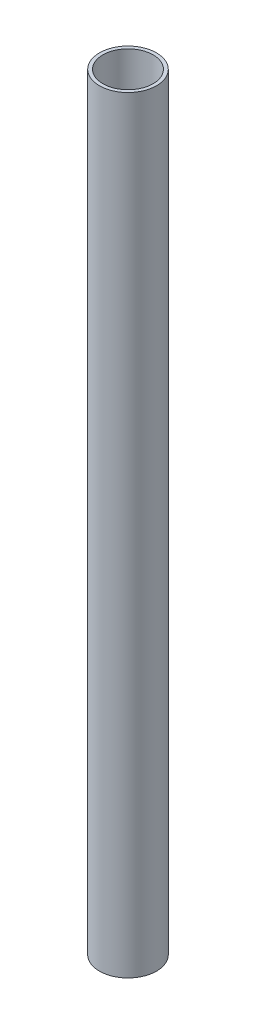
ISO-10303-21;
HEADER;
FILE_DESCRIPTION(('STEP AP214'),'2;1');
FILE_NAME('part.step','',(''),(''),'','','');
FILE_SCHEMA(('AUTOMOTIVE_DESIGN { 1 0 10303 214 1 1 1 1 }'));
ENDSEC;
DATA;
#1=APPLICATION_CONTEXT('core data for automotive mechanical design processes');
#2=APPLICATION_PROTOCOL_DEFINITION('international standard','automotive_design',2000,#1);
#3=PRODUCT_CONTEXT('',#1,'mechanical');
#4=PRODUCT('Part','Part','',(#3));
#5=PRODUCT_RELATED_PRODUCT_CATEGORY('part','',(#4));
#6=PRODUCT_DEFINITION_FORMATION('','',#4);
#7=PRODUCT_DEFINITION_CONTEXT('part definition',#1,'design');
#8=PRODUCT_DEFINITION('design','',#6,#7);
#9=PRODUCT_DEFINITION_SHAPE('','',#8);
#10=(LENGTH_UNIT() NAMED_UNIT(*) SI_UNIT(.MILLI.,.METRE.));
#11=(NAMED_UNIT(*) PLANE_ANGLE_UNIT() SI_UNIT($,.RADIAN.));
#12=(NAMED_UNIT(*) SI_UNIT($,.STERADIAN.) SOLID_ANGLE_UNIT());
#13=UNCERTAINTY_MEASURE_WITH_UNIT(LENGTH_MEASURE(1.E-05),#10,'distance_accuracy_value','');
#14=(GEOMETRIC_REPRESENTATION_CONTEXT(3) GLOBAL_UNCERTAINTY_ASSIGNED_CONTEXT((#13)) GLOBAL_UNIT_ASSIGNED_CONTEXT((#10,
#11,#12)) REPRESENTATION_CONTEXT('',''));
#15=CARTESIAN_POINT('',(0.,0.,0.));
#16=DIRECTION('',(0.,0.,1.));
#17=DIRECTION('',(1.,0.,0.));
#18=AXIS2_PLACEMENT_3D('',#15,#16,#17);
#19=CARTESIAN_POINT('',(0.,336.16,0.));
#20=DIRECTION('',(0.,1.,0.));
#21=DIRECTION('',(0.,0.,1.));
#22=AXIS2_PLACEMENT_3D('',#19,#20,#21);
#23=PLANE('',#22);
#24=CARTESIAN_POINT('',(0.,336.16,0.));
#25=DIRECTION('',(0.,1.,0.));
#26=DIRECTION('',(0.,0.,1.));
#27=AXIS2_PLACEMENT_3D('',#24,#25,#26);
#28=CIRCLE('',#27,12.5);
#29=CARTESIAN_POINT('',(0.,336.16,12.5));
#30=VERTEX_POINT('',#29);
#31=EDGE_CURVE('E10',#30,#30,#28,.T.);
#32=ORIENTED_EDGE('',*,*,#31,.T.);
#33=EDGE_LOOP('',(#32));
#34=FACE_BOUND('',#33,.T.);
#35=CARTESIAN_POINT('',(0.,336.16,0.));
#36=DIRECTION('',(0.,1.,0.));
#37=DIRECTION('',(0.,0.,1.));
#38=AXIS2_PLACEMENT_3D('',#35,#36,#37);
#39=CIRCLE('',#38,11.);
#40=CARTESIAN_POINT('',(0.,336.16,11.));
#41=VERTEX_POINT('',#40);
#42=EDGE_CURVE('E48',#41,#41,#39,.T.);
#43=ORIENTED_EDGE('',*,*,#42,.F.);
#44=EDGE_LOOP('',(#43));
#45=FACE_BOUND('',#44,.T.);
#46=ADVANCED_FACE('F37',(#34,#45),#23,.T.);
#47=CARTESIAN_POINT('',(0.,0.,0.));
#48=DIRECTION('',(0.,1.,0.));
#49=DIRECTION('',(0.,0.,1.));
#50=AXIS2_PLACEMENT_3D('',#47,#48,#49);
#51=PLANE('',#50);
#52=CARTESIAN_POINT('',(0.,0.,0.));
#53=DIRECTION('',(0.,1.,0.));
#54=DIRECTION('',(0.,0.,1.));
#55=AXIS2_PLACEMENT_3D('',#52,#53,#54);
#56=CIRCLE('',#55,12.5);
#57=CARTESIAN_POINT('',(0.,0.,12.5));
#58=VERTEX_POINT('',#57);
#59=EDGE_CURVE('E41',#58,#58,#56,.T.);
#60=ORIENTED_EDGE('',*,*,#59,.F.);
#61=EDGE_LOOP('',(#60));
#62=FACE_BOUND('',#61,.T.);
#63=CARTESIAN_POINT('',(0.,0.,0.));
#64=DIRECTION('',(0.,1.,0.));
#65=DIRECTION('',(0.,0.,1.));
#66=AXIS2_PLACEMENT_3D('',#63,#64,#65);
#67=CIRCLE('',#66,11.);
#68=CARTESIAN_POINT('',(0.,0.,11.));
#69=VERTEX_POINT('',#68);
#70=EDGE_CURVE('E50',#69,#69,#67,.T.);
#71=ORIENTED_EDGE('',*,*,#70,.T.);
#72=EDGE_LOOP('',(#71));
#73=FACE_BOUND('',#72,.T.);
#74=ADVANCED_FACE('F60',(#62,#73),#51,.F.);
#75=CARTESIAN_POINT('',(0.,336.16,0.));
#76=DIRECTION('',(0.,-1.,0.));
#77=DIRECTION('',(0.,0.,-1.));
#78=AXIS2_PLACEMENT_3D('',#75,#76,#77);
#79=CYLINDRICAL_SURFACE('',#78,12.5);
#80=ORIENTED_EDGE('',*,*,#31,.F.);
#81=EDGE_LOOP('',(#80));
#82=FACE_BOUND('',#81,.T.);
#83=ORIENTED_EDGE('',*,*,#59,.T.);
#84=EDGE_LOOP('',(#83));
#85=FACE_BOUND('',#84,.T.);
#86=ADVANCED_FACE('F39',(#82,#85),#79,.T.);
#87=CARTESIAN_POINT('',(0.,336.16,0.));
#88=DIRECTION('',(0.,-1.,0.));
#89=DIRECTION('',(0.,0.,-1.));
#90=AXIS2_PLACEMENT_3D('',#87,#88,#89);
#91=CYLINDRICAL_SURFACE('',#90,11.);
#92=ORIENTED_EDGE('',*,*,#42,.T.);
#93=EDGE_LOOP('',(#92));
#94=FACE_BOUND('',#93,.T.);
#95=ORIENTED_EDGE('',*,*,#70,.F.);
#96=EDGE_LOOP('',(#95));
#97=FACE_BOUND('',#96,.T.);
#98=ADVANCED_FACE('F56',(#94,#97),#91,.F.);
#99=CLOSED_SHELL('',(#46,#74,#86,#98));
#100=MANIFOLD_SOLID_BREP('B2',#99);
#101=ADVANCED_BREP_SHAPE_REPRESENTATION('',(#18,#100),#14);
#102=SHAPE_DEFINITION_REPRESENTATION(#9,#101);
ENDSEC;
END-ISO-10303-21;
